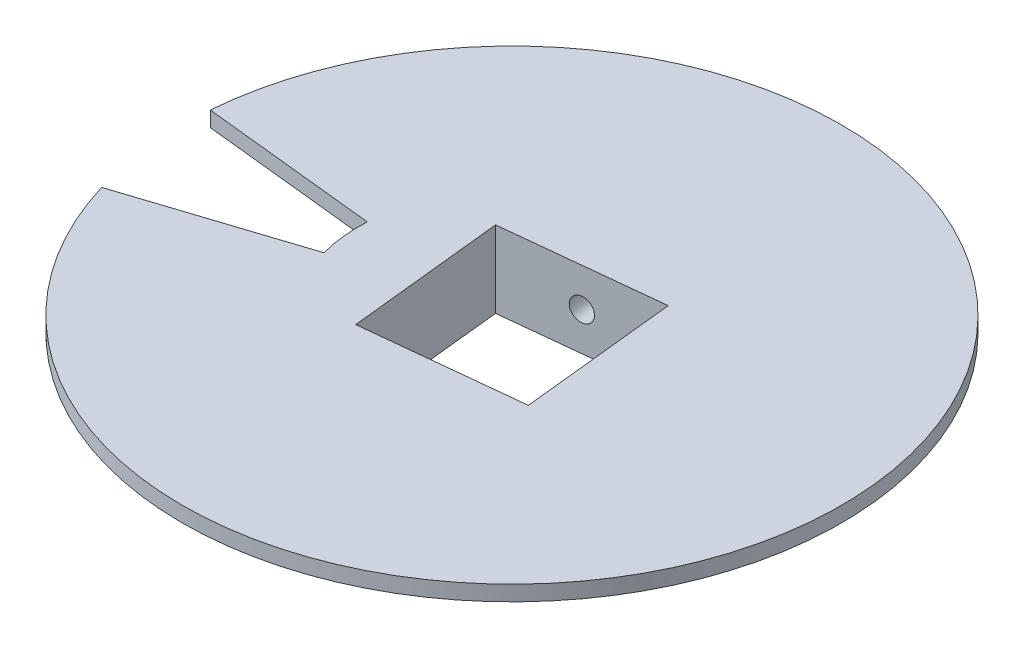
ISO-10303-21;
HEADER;
FILE_DESCRIPTION(('STEP AP214'),'2;1');
FILE_NAME('part.step','',(''),(''),'','','');
FILE_SCHEMA(('AUTOMOTIVE_DESIGN { 1 0 10303 214 1 1 1 1 }'));
ENDSEC;
DATA;
#1=APPLICATION_CONTEXT('core data for automotive mechanical design processes');
#2=APPLICATION_PROTOCOL_DEFINITION('international standard','automotive_design',2000,#1);
#3=PRODUCT_CONTEXT('',#1,'mechanical');
#4=PRODUCT('Part','Part','',(#3));
#5=PRODUCT_RELATED_PRODUCT_CATEGORY('part','',(#4));
#6=PRODUCT_DEFINITION_FORMATION('','',#4);
#7=PRODUCT_DEFINITION_CONTEXT('part definition',#1,'design');
#8=PRODUCT_DEFINITION('design','',#6,#7);
#9=PRODUCT_DEFINITION_SHAPE('','',#8);
#10=(LENGTH_UNIT() NAMED_UNIT(*) SI_UNIT(.MILLI.,.METRE.));
#11=(NAMED_UNIT(*) PLANE_ANGLE_UNIT() SI_UNIT($,.RADIAN.));
#12=(NAMED_UNIT(*) SI_UNIT($,.STERADIAN.) SOLID_ANGLE_UNIT());
#13=UNCERTAINTY_MEASURE_WITH_UNIT(LENGTH_MEASURE(1.E-05),#10,'distance_accuracy_value','');
#14=(GEOMETRIC_REPRESENTATION_CONTEXT(3) GLOBAL_UNCERTAINTY_ASSIGNED_CONTEXT((#13)) GLOBAL_UNIT_ASSIGNED_CONTEXT((#10,
#11,#12)) REPRESENTATION_CONTEXT('',''));
#15=CARTESIAN_POINT('',(0.,0.,0.));
#16=DIRECTION('',(0.,0.,1.));
#17=DIRECTION('',(1.,0.,0.));
#18=AXIS2_PLACEMENT_3D('',#15,#16,#17);
#19=CARTESIAN_POINT('',(0.,-4.,0.));
#20=DIRECTION('',(0.,-1.,0.));
#21=DIRECTION('',(1.,0.,0.));
#22=AXIS2_PLACEMENT_3D('',#19,#20,#21);
#23=PLANE('',#22);
#24=DIRECTION('',(-0.994521895368273,0.,-0.104528463267653));
#25=VECTOR('',#24,1.);
#26=CARTESIAN_POINT('',(-0.209056926535306,-4.00000000000001,1.98904379073655));
#27=LINE('',#26,#25);
#28=CARTESIAN_POINT('',(-39.9401755287793,-4.00000000000001,-2.18686504620218));
#29=VERTEX_POINT('',#28);
#30=CARTESIAN_POINT('',(-85.7148083840375,-4.00000000000001,-6.99797282702119));
#31=VERTEX_POINT('',#30);
#32=EDGE_CURVE('E153',#29,#31,#27,.T.);
#33=ORIENTED_EDGE('',*,*,#32,.T.);
#34=CARTESIAN_POINT('',(0.,-4.,0.));
#35=DIRECTION('',(0.,1.,0.));
#36=DIRECTION('',(-1.,0.,0.));
#37=AXIS2_PLACEMENT_3D('',#34,#35,#36);
#38=CIRCLE('',#37,86.);
#39=CARTESIAN_POINT('',(-82.3867738054415,-4.00000000000001,24.6661610699967));
#40=VERTEX_POINT('',#39);
#41=EDGE_CURVE('E172',#40,#31,#38,.T.);
#42=ORIENTED_EDGE('',*,*,#41,.F.);
#43=DIRECTION('',(-0.951056516295154,0.,0.309016994374948));
#44=VECTOR('',#43,1.);
#45=CARTESIAN_POINT('',(-0.618033988749895,-4.00000000000001,-1.90211303259031));
#46=LINE('',#45,#44);
#47=CARTESIAN_POINT('',(-38.6127120570164,-4.00000000000001,10.4431062238179));
#48=VERTEX_POINT('',#47);
#49=EDGE_CURVE('E156',#48,#40,#46,.T.);
#50=ORIENTED_EDGE('',*,*,#49,.F.);
#51=CARTESIAN_POINT('',(0.,-4.00000000000001,0.));
#52=DIRECTION('',(0.,1.,0.));
#53=DIRECTION('',(0.,0.,1.));
#54=AXIS2_PLACEMENT_3D('',#51,#52,#53);
#55=CIRCLE('',#54,40.);
#56=EDGE_CURVE('E167',#48,#29,#55,.T.);
#57=ORIENTED_EDGE('',*,*,#56,.T.);
#58=EDGE_LOOP('',(#33,#42,#50,#57));
#59=FACE_BOUND('',#58,.T.);
#60=ADVANCED_FACE('F37',(#59),#23,.T.);
#61=CARTESIAN_POINT('',(0.,0.,0.));
#62=DIRECTION('',(0.,1.,0.));
#63=DIRECTION('',(-1.,0.,0.));
#64=AXIS2_PLACEMENT_3D('',#61,#62,#63);
#65=CYLINDRICAL_SURFACE('',#64,86.);
#66=DIRECTION('',(0.,1.,0.));
#67=VECTOR('',#66,1.);
#68=CARTESIAN_POINT('',(-85.7148083840375,0.,-6.99797282702119));
#69=LINE('',#68,#67);
#70=CARTESIAN_POINT('',(-85.7148083840375,0.,-6.99797282702119));
#71=VERTEX_POINT('',#70);
#72=EDGE_CURVE('E165',#71,#31,#69,.F.);
#73=ORIENTED_EDGE('',*,*,#72,.F.);
#74=CARTESIAN_POINT('',(0.,0.,0.));
#75=DIRECTION('',(0.,1.,0.));
#76=DIRECTION('',(-1.,0.,0.));
#77=AXIS2_PLACEMENT_3D('',#74,#75,#76);
#78=CIRCLE('',#77,86.);
#79=CARTESIAN_POINT('',(-82.3867738054415,0.,24.6661610699967));
#80=VERTEX_POINT('',#79);
#81=EDGE_CURVE('E169',#80,#71,#78,.T.);
#82=ORIENTED_EDGE('',*,*,#81,.F.);
#83=DIRECTION('',(0.,1.,0.));
#84=VECTOR('',#83,1.);
#85=CARTESIAN_POINT('',(-82.3867738054415,0.,24.6661610699967));
#86=LINE('',#85,#84);
#87=EDGE_CURVE('E159',#80,#40,#86,.F.);
#88=ORIENTED_EDGE('',*,*,#87,.T.);
#89=ORIENTED_EDGE('',*,*,#41,.T.);
#90=EDGE_LOOP('',(#73,#82,#88,#89));
#91=FACE_BOUND('',#90,.T.);
#92=ADVANCED_FACE('F195',(#91),#65,.T.);
#93=CARTESIAN_POINT('',(0.,0.,0.));
#94=DIRECTION('',(0.,1.,0.));
#95=DIRECTION('',(-1.,0.,0.));
#96=AXIS2_PLACEMENT_3D('',#93,#94,#95);
#97=PLANE('',#96);
#98=DIRECTION('',(0.994521895368273,0.,-0.104528463267654));
#99=VECTOR('',#98,1.);
#100=CARTESIAN_POINT('',(2.14283349698691,0.,20.3876988550496));
#101=LINE('',#100,#99);
#102=CARTESIAN_POINT('',(-18.2448653580628,0.,22.5305323520365));
#103=VERTEX_POINT('',#102);
#104=CARTESIAN_POINT('',(22.5305323520365,0.,18.2448653580627));
#105=VERTEX_POINT('',#104);
#106=EDGE_CURVE('E52',#103,#105,#101,.T.);
#107=ORIENTED_EDGE('',*,*,#106,.F.);
#108=DIRECTION('',(0.104528463267654,0.,0.994521895368273));
#109=VECTOR('',#108,1.);
#110=CARTESIAN_POINT('',(-20.3876988550497,0.,2.14283349698692));
#111=LINE('',#110,#109);
#112=CARTESIAN_POINT('',(-22.5305323520367,0.,-18.2448653580628));
#113=VERTEX_POINT('',#112);
#114=EDGE_CURVE('E120',#113,#103,#111,.T.);
#115=ORIENTED_EDGE('',*,*,#114,.F.);
#116=DIRECTION('',(-0.994521895368273,0.,0.104528463267654));
#117=VECTOR('',#116,1.);
#118=CARTESIAN_POINT('',(-2.14283349698692,0.,-20.3876988550497));
#119=LINE('',#118,#117);
#120=CARTESIAN_POINT('',(18.2448653580627,0.,-22.5305323520367));
#121=VERTEX_POINT('',#120);
#122=EDGE_CURVE('E123',#121,#113,#119,.T.);
#123=ORIENTED_EDGE('',*,*,#122,.F.);
#124=DIRECTION('',(-0.104528463267654,0.,-0.994521895368273));
#125=VECTOR('',#124,1.);
#126=CARTESIAN_POINT('',(20.3876988550496,0.,-2.14283349698691));
#127=LINE('',#126,#125);
#128=EDGE_CURVE('E137',#105,#121,#127,.T.);
#129=ORIENTED_EDGE('',*,*,#128,.F.);
#130=EDGE_LOOP('',(#107,#115,#123,#129));
#131=FACE_BOUND('',#130,.T.);
#132=DIRECTION('',(-0.994521895368273,0.,-0.104528463267653));
#133=VECTOR('',#132,1.);
#134=CARTESIAN_POINT('',(-0.209056926535306,0.,1.98904379073655));
#135=LINE('',#134,#133);
#136=CARTESIAN_POINT('',(-39.9401755287793,0.,-2.18686504620218));
#137=VERTEX_POINT('',#136);
#138=EDGE_CURVE('E150',#137,#71,#135,.T.);
#139=ORIENTED_EDGE('',*,*,#138,.F.);
#140=CARTESIAN_POINT('',(0.,0.,0.));
#141=DIRECTION('',(0.,-1.,0.));
#142=DIRECTION('',(1.,0.,0.));
#143=AXIS2_PLACEMENT_3D('',#140,#141,#142);
#144=CIRCLE('',#143,40.);
#145=CARTESIAN_POINT('',(-38.6127120570164,0.,10.4431062238179));
#146=VERTEX_POINT('',#145);
#147=EDGE_CURVE('E143',#146,#137,#144,.T.);
#148=ORIENTED_EDGE('',*,*,#147,.F.);
#149=DIRECTION('',(-0.951056516295154,0.,0.309016994374948));
#150=VECTOR('',#149,1.);
#151=CARTESIAN_POINT('',(-0.618033988749895,0.,-1.90211303259031));
#152=LINE('',#151,#150);
#153=EDGE_CURVE('E157',#146,#80,#152,.T.);
#154=ORIENTED_EDGE('',*,*,#153,.T.);
#155=ORIENTED_EDGE('',*,*,#81,.T.);
#156=EDGE_LOOP('',(#139,#148,#154,#155));
#157=FACE_BOUND('',#156,.T.);
#158=ADVANCED_FACE('F192',(#131,#157),#97,.T.);
#159=CARTESIAN_POINT('',(-0.618033988749895,-4.00000000000001,-1.90211303259031));
#160=DIRECTION('',(-0.309016994374948,0.,-0.951056516295154));
#161=DIRECTION('',(-0.951056516295154,0.,0.309016994374948));
#162=AXIS2_PLACEMENT_3D('',#159,#160,#161);
#163=PLANE('',#162);
#164=ORIENTED_EDGE('',*,*,#153,.F.);
#165=DIRECTION('',(0.,1.,0.));
#166=VECTOR('',#165,1.);
#167=CARTESIAN_POINT('',(-38.6127120570164,-4.00000000000001,10.4431062238179));
#168=LINE('',#167,#166);
#169=EDGE_CURVE('E45',#146,#48,#168,.F.);
#170=ORIENTED_EDGE('',*,*,#169,.T.);
#171=ORIENTED_EDGE('',*,*,#49,.T.);
#172=ORIENTED_EDGE('',*,*,#87,.F.);
#173=EDGE_LOOP('',(#164,#170,#171,#172));
#174=FACE_BOUND('',#173,.T.);
#175=ADVANCED_FACE('F178',(#174),#163,.T.);
#176=CARTESIAN_POINT('',(-0.209056926535306,-4.00000000000001,1.98904379073655));
#177=DIRECTION('',(0.104528463267653,0.,-0.994521895368273));
#178=DIRECTION('',(-0.994521895368273,0.,-0.104528463267653));
#179=AXIS2_PLACEMENT_3D('',#176,#177,#178);
#180=PLANE('',#179);
#181=ORIENTED_EDGE('',*,*,#72,.T.);
#182=ORIENTED_EDGE('',*,*,#32,.F.);
#183=DIRECTION('',(0.,1.,0.));
#184=VECTOR('',#183,1.);
#185=CARTESIAN_POINT('',(-39.9401755287793,-4.00000000000001,-2.18686504620218));
#186=LINE('',#185,#184);
#187=EDGE_CURVE('E11',#137,#29,#186,.F.);
#188=ORIENTED_EDGE('',*,*,#187,.F.);
#189=ORIENTED_EDGE('',*,*,#138,.T.);
#190=EDGE_LOOP('',(#181,#182,#188,#189));
#191=FACE_BOUND('',#190,.T.);
#192=ADVANCED_FACE('F189',(#191),#180,.F.);
#193=CARTESIAN_POINT('',(0.,-20.,0.));
#194=DIRECTION('',(0.,1.,0.));
#195=DIRECTION('',(-1.,0.,0.));
#196=AXIS2_PLACEMENT_3D('',#193,#194,#195);
#197=CYLINDRICAL_SURFACE('',#196,40.);
#198=CARTESIAN_POINT('',(-1.18579680908048,-10.,-39.9824197107626));
#199=CARTESIAN_POINT('',(-1.18580429969003,-9.8317431314442,-39.9824204307887));
#200=CARTESIAN_POINT('',(-1.20003427236242,-9.6633702964108,-39.9820053141335));
#201=CARTESIAN_POINT('',(-1.25658390792008,-9.33127916870422,-39.980267210594));
#202=CARTESIAN_POINT('',(-1.29893577541237,-9.16756643710408,-39.9789431827847));
#203=CARTESIAN_POINT('',(-1.41047349603417,-8.84965363313913,-39.9751630370906));
#204=CARTESIAN_POINT('',(-1.47964459167795,-8.69544838320168,-39.9727075416647));
#205=CARTESIAN_POINT('',(-1.64278985708904,-8.40085498908478,-39.966334253512));
#206=CARTESIAN_POINT('',(-1.73675856089689,-8.2604638093195,-39.9624167829592));
#207=CARTESIAN_POINT('',(-1.94699418178614,-7.99714995243253,-39.95272549713));
#208=CARTESIAN_POINT('',(-2.06330232138514,-7.8742603122085,-39.9469482364849));
#209=CARTESIAN_POINT('',(-2.31477157254382,-7.64972135070457,-39.9331648643504));
#210=CARTESIAN_POINT('',(-2.4499334909992,-7.54807293896273,-39.9251586574528));
#211=CARTESIAN_POINT('',(-2.73541234024617,-7.36879489583059,-39.9066156468007));
#212=CARTESIAN_POINT('',(-2.8857467563554,-7.29119340581087,-39.8960759035371));
#213=CARTESIAN_POINT('',(-3.19713303622388,-7.1623920757591,-39.8723299563986));
#214=CARTESIAN_POINT('',(-3.35818474404619,-7.11119185168257,-39.8591237913145));
#215=CARTESIAN_POINT('',(-3.68607728581946,-7.03674032139104,-39.8301375467512));
#216=CARTESIAN_POINT('',(-3.85290655217476,-7.01343615404408,-39.8143623999964));
#217=CARTESIAN_POINT('',(-4.18787477133608,-6.99527491555166,-39.7805233383962));
#218=CARTESIAN_POINT('',(-4.35601370390763,-7.00041740576974,-39.7624594588464));
#219=CARTESIAN_POINT('',(-4.68847586567301,-7.03896012170817,-39.7246288542982));
#220=CARTESIAN_POINT('',(-4.85280608856538,-7.07230349768423,-39.7048656269405));
#221=CARTESIAN_POINT('',(-5.17336864882447,-7.16621316779689,-39.6643716135608));
#222=CARTESIAN_POINT('',(-5.32960092165512,-7.22677967884922,-39.6436408198304));
#223=CARTESIAN_POINT('',(-5.62975028238228,-7.37348016036666,-39.6021327031986));
#224=CARTESIAN_POINT('',(-5.77365485665011,-7.45963972278195,-39.5813553544822));
#225=CARTESIAN_POINT('',(-6.04497820835389,-7.65506196118452,-39.5408280866301));
#226=CARTESIAN_POINT('',(-6.17239671592198,-7.76432501528615,-39.5210781843163));
#227=CARTESIAN_POINT('',(-6.40751495172782,-8.00317335931485,-39.4836420714088));
#228=CARTESIAN_POINT('',(-6.5151653563531,-8.13280802383177,-39.4659610617234));
#229=CARTESIAN_POINT('',(-6.7073682982983,-8.40854727465756,-39.4337512557431));
#230=CARTESIAN_POINT('',(-6.7919208214047,-8.55465187110129,-39.4192224613879));
#231=CARTESIAN_POINT('',(-6.93557490212524,-8.85921700874966,-39.3942019101334));
#232=CARTESIAN_POINT('',(-6.9946741225029,-9.01767868305944,-39.3837105239765));
#233=CARTESIAN_POINT('',(-7.08574651351229,-9.34244416121864,-39.3674275932348));
#234=CARTESIAN_POINT('',(-7.11772014491847,-9.5087478318077,-39.3616359688168));
#235=CARTESIAN_POINT('',(-7.15359367659644,-9.84404315381494,-39.3551322688095));
#236=CARTESIAN_POINT('',(-7.15756172898413,-10.0130272761831,-39.3544078620867));
#237=CARTESIAN_POINT('',(-7.1374924861896,-10.349267519701,-39.3580525557769));
#238=CARTESIAN_POINT('',(-7.11345540193857,-10.5165236538561,-39.3624216178265));
#239=CARTESIAN_POINT('',(-7.03809874791777,-10.8443631467125,-39.3759649238287));
#240=CARTESIAN_POINT('',(-6.98681081753996,-11.0049540114315,-39.3851335950488));
#241=CARTESIAN_POINT('',(-6.85840739298776,-11.3151365347476,-39.4076956011325));
#242=CARTESIAN_POINT('',(-6.78129156215627,-11.4647280499413,-39.4210889910637));
#243=CARTESIAN_POINT('',(-6.60320177495021,-11.7489821051146,-39.4513100977189));
#244=CARTESIAN_POINT('',(-6.50218211927371,-11.883615314204,-39.4681443842433));
#245=CARTESIAN_POINT('',(-6.27916364078341,-12.1338349964868,-39.5042381338401));
#246=CARTESIAN_POINT('',(-6.15716452478055,-12.2494212034533,-39.523497630804));
#247=CARTESIAN_POINT('',(-5.89529910367278,-12.4585005042157,-39.5634047008749));
#248=CARTESIAN_POINT('',(-5.75539743811936,-12.5519488013881,-39.5840549817007));
#249=CARTESIAN_POINT('',(-5.4618209595312,-12.7137926301878,-39.6256288418666));
#250=CARTESIAN_POINT('',(-5.30814626149196,-12.7821883709628,-39.6465524189236));
#251=CARTESIAN_POINT('',(-4.99150511403241,-12.89190821671,-39.6876595051506));
#252=CARTESIAN_POINT('',(-4.82854845934879,-12.9332603044185,-39.7078437588306));
#253=CARTESIAN_POINT('',(-4.49781051822772,-12.9878105194003,-39.7466654160615));
#254=CARTESIAN_POINT('',(-4.33002930408568,-13.0010090683283,-39.7653028427753));
#255=CARTESIAN_POINT('',(-3.99483605055098,-12.9988730255785,-39.8003720238971));
#256=CARTESIAN_POINT('',(-3.82742411553962,-12.9836083708725,-39.8168090785007));
#257=CARTESIAN_POINT('',(-3.49732177617217,-12.925124712337,-39.8471608051493));
#258=CARTESIAN_POINT('',(-3.33463137914973,-12.8819056650902,-39.8610754732767));
#259=CARTESIAN_POINT('',(-3.01861115686088,-12.7687570389133,-39.886252439809));
#260=CARTESIAN_POINT('',(-2.86528102613292,-12.6988283321634,-39.8975148248024));
#261=CARTESIAN_POINT('',(-2.57233838393239,-12.5342539344931,-39.9174730857667));
#262=CARTESIAN_POINT('',(-2.43272559565276,-12.4396087424764,-39.9261690135341));
#263=CARTESIAN_POINT('',(-2.17087597977937,-12.2280263784834,-39.9412639787596));
#264=CARTESIAN_POINT('',(-2.04868038476335,-12.1110377937764,-39.9476576187264));
#265=CARTESIAN_POINT('',(-1.82552545276615,-11.858175270943,-39.9584781228353));
#266=CARTESIAN_POINT('',(-1.72457128867604,-11.7222967459289,-39.9629045081865));
#267=CARTESIAN_POINT('',(-1.54670970260564,-11.435295383436,-39.9701845149496));
#268=CARTESIAN_POINT('',(-1.46984089096274,-11.2841485775931,-39.9730356166103));
#269=CARTESIAN_POINT('',(-1.34268429679903,-10.9711815421287,-39.9775097362102));
#270=CARTESIAN_POINT('',(-1.29236570532633,-10.8093739297954,-39.9791341785169));
#271=CARTESIAN_POINT('',(-1.23270114281652,-10.5388300296903,-39.9810074404126));
#272=CARTESIAN_POINT('',(-1.21513556340589,-10.4318377399973,-39.9815405569221));
#273=CARTESIAN_POINT('',(-1.19168099779456,-10.2165796506869,-39.9822464599635));
#274=CARTESIAN_POINT('',(-1.1857919870676,-10.1083138537451,-39.9824192472522));
#275=CARTESIAN_POINT('',(-1.18579680908048,-10.,-39.9824197107626));
#276=B_SPLINE_CURVE_WITH_KNOTS('',3,(#198,#199,#200,#201,#202,#203,#204,#205,#206,#207,#208,
#209,#210,#211,#212,#213,#214,#215,#216,#217,#218,#219,#220,#221,#222,#223,#224,#225,#226,#227,
#228,#229,#230,#231,#232,#233,#234,#235,#236,#237,#238,#239,#240,#241,#242,#243,#244,#245,#246,
#247,#248,#249,#250,#251,#252,#253,#254,#255,#256,#257,#258,#259,#260,#261,#262,#263,#264,#265,
#266,#267,#268,#269,#270,#271,#272,#273,#274,#275),.UNSPECIFIED.,.T.,.F.,(4,2,2,2,2,2,2,2,2,2,2,
2,2,2,2,2,2,2,2,2,2,2,2,2,2,2,2,2,2,2,2,2,2,2,2,2,2,2,4),(0.,0.504375158678085,1.00932891572159,
1.51400521152438,2.01857035792286,2.52407567218004,3.0296026274716,3.53571897042051,
4.04182795096937,4.54697636348321,5.05211698682554,5.55624172519159,6.06037048052796,
6.5650050497415,7.06964787850087,7.57553322812759,8.08141888905544,8.58735099277641,
9.09327450220475,9.59796641118963,10.1026545189226,10.6067579386191,11.110867929372,
11.6159495765132,12.1210382827706,12.6271404816974,13.1332384554068,13.638811924989,
14.1443778225593,14.6487031301784,15.1530292210894,15.6573388450885,16.1616382903561,
16.6671124356828,17.1727095361933,17.6791130423731,18.1849276168994,18.5096152946703,
18.8343022904443),.UNSPECIFIED.);
#277=CARTESIAN_POINT('',(-1.18579680908048,-10.,-39.9824197107626));
#278=VERTEX_POINT('',#277);
#279=EDGE_CURVE('E126',#278,#278,#276,.T.);
#280=ORIENTED_EDGE('',*,*,#279,.T.);
#281=EDGE_LOOP('',(#280));
#282=FACE_BOUND('',#281,.T.);
#283=CARTESIAN_POINT('',(7.15292818129011,-10.,39.3552489311566));
#284=CARTESIAN_POINT('',(7.1529210040702,-10.1682568685558,39.3552511928337));
#285=CARTESIAN_POINT('',(7.13891568283652,-10.3366297035892,39.357803725152));
#286=CARTESIAN_POINT('',(7.08324042044772,-10.6687208312958,39.367860933689));
#287=CARTESIAN_POINT('',(7.04153876201303,-10.8324335628959,39.3753712874437));
#288=CARTESIAN_POINT('',(6.93165247171269,-11.1503463668609,39.394863743087));
#289=CARTESIAN_POINT('',(6.8634824042628,-11.3045516167983,39.4068433855785));
#290=CARTESIAN_POINT('',(6.70257717321396,-11.5991450109152,39.4345291770437));
#291=CARTESIAN_POINT('',(6.6098474231139,-11.7395361906805,39.4502345047142));
#292=CARTESIAN_POINT('',(6.40219102332934,-12.0028500475675,39.4844654401415));
#293=CARTESIAN_POINT('',(6.28722333560576,-12.1257396877915,39.5029962484627));
#294=CARTESIAN_POINT('',(6.0383835667209,-12.3502786492954,39.5417974732763));
#295=CARTESIAN_POINT('',(5.90451067646009,-12.4519270610373,39.5620679642087));
#296=CARTESIAN_POINT('',(5.62141491631137,-12.6312051041694,39.6032845530686));
#297=CARTESIAN_POINT('',(5.4721743320437,-12.7088065941891,39.6242314111243));
#298=CARTESIAN_POINT('',(5.16265552946929,-12.8376079242409,39.6657452178486));
#299=CARTESIAN_POINT('',(5.00237747175696,-12.8888081483174,39.6863121720391));
#300=CARTESIAN_POINT('',(4.67562358960531,-12.963259678609,39.7261320392318));
#301=CARTESIAN_POINT('',(4.509160105553,-12.9865638459559,39.7453873721282));
#302=CARTESIAN_POINT('',(4.1744762091453,-13.0047250844483,39.7819315840289));
#303=CARTESIAN_POINT('',(4.00625582392056,-12.9995825942303,39.7992204933505));
#304=CARTESIAN_POINT('',(3.67319333309872,-12.9610398782918,39.8313393484631));
#305=CARTESIAN_POINT('',(3.50834511383254,-12.9276965023158,39.8461741695344));
#306=CARTESIAN_POINT('',(3.18636843584026,-12.8337868322031,39.8732137514193));
#307=CARTESIAN_POINT('',(3.02924003863728,-12.7732203211508,39.8854184912751));
#308=CARTESIAN_POINT('',(2.72701963886865,-12.6265198396333,39.9072219876674));
#309=CARTESIAN_POINT('',(2.58193987111161,-12.540360277218,39.9168181172232));
#310=CARTESIAN_POINT('',(2.30811949283614,-12.3449380388155,39.9335877642204));
#311=CARTESIAN_POINT('',(2.17937914978578,-12.2356749847138,39.9407612420074));
#312=CARTESIAN_POINT('',(1.94161540601129,-11.9968266406851,39.9530270279346));
#313=CARTESIAN_POINT('',(1.83264133238999,-11.8671919761682,39.9581141683752));
#314=CARTESIAN_POINT('',(1.63794169065004,-11.5914527253424,39.9665694625754));
#315=CARTESIAN_POINT('',(1.55221613683761,-11.4453481288987,39.9699376152773));
#316=CARTESIAN_POINT('',(1.40649917732867,-11.1407829912503,39.9753311859142));
#317=CARTESIAN_POINT('',(1.34651013487612,-10.9823213169406,39.9773564805511));
#318=CARTESIAN_POINT('',(1.25404248245523,-10.6575558387814,39.9803643857149));
#319=CARTESIAN_POINT('',(1.22156340518318,-10.4912521681923,39.9813470139532));
#320=CARTESIAN_POINT('',(1.18512160097745,-10.1559568461851,39.982443962022));
#321=CARTESIAN_POINT('',(1.18108964742827,-9.98697272381689,39.9825603898053));
#322=CARTESIAN_POINT('',(1.20147810354393,-9.650732480299,39.9819528079909));
#323=CARTESIAN_POINT('',(1.22589829891072,-9.48347634614387,39.9812288047232));
#324=CARTESIAN_POINT('',(1.30242404089067,-9.15563685328747,39.9788086276435));
#325=CARTESIAN_POINT('',(1.35449748087225,-8.99504598856854,39.9771135810759));
#326=CARTESIAN_POINT('',(1.4847858873571,-8.68486346525242,39.972485980089));
#327=CARTESIAN_POINT('',(1.56300119460988,-8.53527195005865,39.9695534095389));
#328=CARTESIAN_POINT('',(1.74348261406376,-8.2510178948854,39.9620871637299));
#329=CARTESIAN_POINT('',(1.84579479286567,-8.11638468579604,39.9575504132862));
#330=CARTESIAN_POINT('',(2.07144409502689,-7.86616500351318,39.9464872789092));
#331=CARTESIAN_POINT('',(2.19478151221479,-7.75057879654675,39.9399608671694));
#332=CARTESIAN_POINT('',(2.45922169200054,-7.54149949578429,39.9245509895424));
#333=CARTESIAN_POINT('',(2.60035960530264,-7.44805119861195,39.9156628203532));
#334=CARTESIAN_POINT('',(2.89616442502644,-7.28620736981222,39.8952902098801));
#335=CARTESIAN_POINT('',(3.05083121849089,-7.21781162903718,39.8838057902719));
#336=CARTESIAN_POINT('',(3.36909964097408,-7.10809178329002,39.8581811916872));
#337=CARTESIAN_POINT('',(3.53269184408697,-7.06673969558153,39.8440437773916));
#338=CARTESIAN_POINT('',(3.86427384406143,-7.01218948059973,39.8132528037126));
#339=CARTESIAN_POINT('',(4.03226357502321,-6.9989909316717,39.7965992820167));
#340=CARTESIAN_POINT('',(4.36742334449297,-7.00112697442154,39.7612115212976));
#341=CARTESIAN_POINT('',(4.53459438287324,-7.01639162912749,39.74248248835));
#342=CARTESIAN_POINT('',(4.86379367292888,-7.074875287663,39.7035388214287));
#343=CARTESIAN_POINT('',(5.02582191661634,-7.11809433490976,39.6833241851477));
#344=CARTESIAN_POINT('',(5.34017092451292,-7.23124296108666,39.6422466758063));
#345=CARTESIAN_POINT('',(5.49249200551131,-7.30117166783664,39.6213838239333));
#346=CARTESIAN_POINT('',(5.78318270391525,-7.46574606550691,39.5799997489578));
#347=CARTESIAN_POINT('',(5.92155260284807,-7.56039125752355,39.5594785189686));
#348=CARTESIAN_POINT('',(6.18081859611057,-7.77197362151663,39.5198020266109));
#349=CARTESIAN_POINT('',(6.30167323669169,-7.88896220622358,39.500650057434));
#350=CARTESIAN_POINT('',(6.52220140732147,-8.14182472905697,39.4648375883411));
#351=CARTESIAN_POINT('',(6.62186977797286,-8.27770325407114,39.4481776956012));
#352=CARTESIAN_POINT('',(6.79735826016561,-8.56470461656404,39.4183191136584));
#353=CARTESIAN_POINT('',(6.87314008121234,-8.71585142240695,39.4051259873074));
#354=CARTESIAN_POINT('',(6.99844822048201,-9.02881845787132,39.3830649941684));
#355=CARTESIAN_POINT('',(7.04800497054996,-9.19062607020459,39.3741921150805));
#356=CARTESIAN_POINT('',(7.10675519226583,-9.4611699703097,39.363619481636));
#357=CARTESIAN_POINT('',(7.12404776277673,-9.56816226000275,39.3604888589552));
#358=CARTESIAN_POINT('',(7.14713655535059,-9.78342034931307,39.3563028579278));
#359=CARTESIAN_POINT('',(7.15293280156122,-9.8916861462549,39.3552474752222));
#360=CARTESIAN_POINT('',(7.15292818129011,-10.,39.3552489311566));
#361=B_SPLINE_CURVE_WITH_KNOTS('',3,(#283,#284,#285,#286,#287,#288,#289,#290,#291,#292,#293,
#294,#295,#296,#297,#298,#299,#300,#301,#302,#303,#304,#305,#306,#307,#308,#309,#310,#311,#312,
#313,#314,#315,#316,#317,#318,#319,#320,#321,#322,#323,#324,#325,#326,#327,#328,#329,#330,#331,
#332,#333,#334,#335,#336,#337,#338,#339,#340,#341,#342,#343,#344,#345,#346,#347,#348,#349,#350,
#351,#352,#353,#354,#355,#356,#357,#358,#359,#360),.UNSPECIFIED.,.T.,.F.,(4,2,2,2,2,2,2,2,2,2,2,
2,2,2,2,2,2,2,2,2,2,2,2,2,2,2,2,2,2,2,2,2,2,2,2,2,2,2,4),(0.,0.504375158678085,1.00932891572159,
1.51400521152438,2.01857035792286,2.52407567218004,3.0296026274716,3.53571897042051,
4.04182795096937,4.54697636348321,5.05211698682554,5.55624172519159,6.06037048052796,
6.56500504974149,7.06964787850087,7.57553322812759,8.08141888905544,8.58735099277641,
9.09327450220475,9.59796641118963,10.1026545189226,10.6067579386191,11.110867929372,
11.6159495765132,12.1210382827706,12.6271404816974,13.1332384554068,13.638811924989,
14.1443778225593,14.6487031301784,15.1530292210894,15.6573388450885,16.1616382903561,
16.6671124356828,17.1727095361933,17.6791130423731,18.1849276168995,18.5096152946703,
18.8343022904443),.UNSPECIFIED.);
#362=CARTESIAN_POINT('',(7.15292818129011,-10.,39.3552489311566));
#363=VERTEX_POINT('',#362);
#364=EDGE_CURVE('E213',#363,#363,#361,.T.);
#365=ORIENTED_EDGE('',*,*,#364,.T.);
#366=EDGE_LOOP('',(#365));
#367=FACE_BOUND('',#366,.T.);
#368=ORIENTED_EDGE('',*,*,#169,.F.);
#369=ORIENTED_EDGE('',*,*,#147,.T.);
#370=ORIENTED_EDGE('',*,*,#187,.T.);
#371=ORIENTED_EDGE('',*,*,#56,.F.);
#372=EDGE_LOOP('',(#368,#369,#370,#371));
#373=FACE_BOUND('',#372,.T.);
#374=CARTESIAN_POINT('',(0.,-20.,0.));
#375=DIRECTION('',(0.,-1.,0.));
#376=DIRECTION('',(1.,0.,0.));
#377=AXIS2_PLACEMENT_3D('',#374,#375,#376);
#378=CIRCLE('',#377,40.);
#379=CARTESIAN_POINT('',(40.,-20.,0.));
#380=VERTEX_POINT('',#379);
#381=EDGE_CURVE('E147',#380,#380,#378,.T.);
#382=ORIENTED_EDGE('',*,*,#381,.F.);
#383=EDGE_LOOP('',(#382));
#384=FACE_BOUND('',#383,.T.);
#385=ADVANCED_FACE('F185',(#282,#367,#373,#384),#197,.T.);
#386=CARTESIAN_POINT('',(0.,-20.,0.));
#387=DIRECTION('',(0.,-1.,0.));
#388=DIRECTION('',(1.,0.,0.));
#389=AXIS2_PLACEMENT_3D('',#386,#387,#388);
#390=PLANE('',#389);
#391=DIRECTION('',(0.994521895368273,0.,-0.104528463267654));
#392=VECTOR('',#391,1.);
#393=CARTESIAN_POINT('',(2.14283349698691,-20.,20.3876988550496));
#394=LINE('',#393,#392);
#395=CARTESIAN_POINT('',(-18.2448653580628,-20.,22.5305323520365));
#396=VERTEX_POINT('',#395);
#397=CARTESIAN_POINT('',(22.5305323520365,-20.,18.2448653580627));
#398=VERTEX_POINT('',#397);
#399=EDGE_CURVE('E104',#396,#398,#394,.T.);
#400=ORIENTED_EDGE('',*,*,#399,.T.);
#401=DIRECTION('',(-0.104528463267654,0.,-0.994521895368273));
#402=VECTOR('',#401,1.);
#403=CARTESIAN_POINT('',(20.3876988550496,-20.,-2.14283349698691));
#404=LINE('',#403,#402);
#405=CARTESIAN_POINT('',(18.2448653580627,-20.,-22.5305323520367));
#406=VERTEX_POINT('',#405);
#407=EDGE_CURVE('E113',#398,#406,#404,.T.);
#408=ORIENTED_EDGE('',*,*,#407,.T.);
#409=DIRECTION('',(-0.994521895368273,0.,0.104528463267654));
#410=VECTOR('',#409,1.);
#411=CARTESIAN_POINT('',(-2.14283349698692,-20.,-20.3876988550497));
#412=LINE('',#411,#410);
#413=CARTESIAN_POINT('',(-22.5305323520367,-20.,-18.2448653580628));
#414=VERTEX_POINT('',#413);
#415=EDGE_CURVE('E60',#406,#414,#412,.T.);
#416=ORIENTED_EDGE('',*,*,#415,.T.);
#417=DIRECTION('',(0.104528463267654,0.,0.994521895368273));
#418=VECTOR('',#417,1.);
#419=CARTESIAN_POINT('',(-20.3876988550497,-20.,2.14283349698692));
#420=LINE('',#419,#418);
#421=EDGE_CURVE('E110',#414,#396,#420,.T.);
#422=ORIENTED_EDGE('',*,*,#421,.T.);
#423=EDGE_LOOP('',(#400,#408,#416,#422));
#424=FACE_BOUND('',#423,.T.);
#425=ORIENTED_EDGE('',*,*,#381,.T.);
#426=EDGE_LOOP('',(#425));
#427=FACE_BOUND('',#426,.T.);
#428=ADVANCED_FACE('F117',(#424,#427),#390,.T.);
#429=CARTESIAN_POINT('',(2.14283349698691,-20.,20.3876988550496));
#430=DIRECTION('',(0.104528463267654,0.,0.994521895368273));
#431=DIRECTION('',(0.994521895368273,0.,-0.104528463267654));
#432=AXIS2_PLACEMENT_3D('',#429,#430,#431);
#433=PLANE('',#432);
#434=CARTESIAN_POINT('',(2.1428334969869,-10.,20.3876988550496));
#435=DIRECTION('',(0.104528463267654,0.,0.994521895368273));
#436=DIRECTION('',(0.994521895368273,0.,-0.104528463267654));
#437=AXIS2_PLACEMENT_3D('',#434,#435,#436);
#438=CIRCLE('',#437,3.);
#439=CARTESIAN_POINT('',(5.12639918309172,-10.,20.0741134652466));
#440=VERTEX_POINT('',#439);
#441=EDGE_CURVE('E219',#440,#440,#438,.T.);
#442=ORIENTED_EDGE('',*,*,#441,.T.);
#443=EDGE_LOOP('',(#442));
#444=FACE_BOUND('',#443,.T.);
#445=ORIENTED_EDGE('',*,*,#106,.T.);
#446=DIRECTION('',(0.,1.,0.));
#447=VECTOR('',#446,1.);
#448=CARTESIAN_POINT('',(22.5305323520365,-20.,18.2448653580627));
#449=LINE('',#448,#447);
#450=EDGE_CURVE('E100',#398,#105,#449,.T.);
#451=ORIENTED_EDGE('',*,*,#450,.F.);
#452=ORIENTED_EDGE('',*,*,#399,.F.);
#453=DIRECTION('',(0.,1.,0.));
#454=VECTOR('',#453,1.);
#455=CARTESIAN_POINT('',(-18.2448653580628,-20.,22.5305323520365));
#456=LINE('',#455,#454);
#457=EDGE_CURVE('E141',#396,#103,#456,.T.);
#458=ORIENTED_EDGE('',*,*,#457,.T.);
#459=EDGE_LOOP('',(#445,#451,#452,#458));
#460=FACE_BOUND('',#459,.T.);
#461=ADVANCED_FACE('F102',(#444,#460),#433,.F.);
#462=CARTESIAN_POINT('',(-20.3876988550497,-20.,2.14283349698692));
#463=DIRECTION('',(-0.994521895368273,0.,0.104528463267654));
#464=DIRECTION('',(0.104528463267654,0.,0.994521895368273));
#465=AXIS2_PLACEMENT_3D('',#462,#463,#464);
#466=PLANE('',#465);
#467=ORIENTED_EDGE('',*,*,#114,.T.);
#468=ORIENTED_EDGE('',*,*,#457,.F.);
#469=ORIENTED_EDGE('',*,*,#421,.F.);
#470=DIRECTION('',(0.,1.,0.));
#471=VECTOR('',#470,1.);
#472=CARTESIAN_POINT('',(-22.5305323520367,-20.,-18.2448653580628));
#473=LINE('',#472,#471);
#474=EDGE_CURVE('E144',#414,#113,#473,.T.);
#475=ORIENTED_EDGE('',*,*,#474,.T.);
#476=EDGE_LOOP('',(#467,#468,#469,#475));
#477=FACE_BOUND('',#476,.T.);
#478=ADVANCED_FACE('F226',(#477),#466,.F.);
#479=CARTESIAN_POINT('',(-2.14283349698692,-20.,-20.3876988550497));
#480=DIRECTION('',(-0.104528463267654,0.,-0.994521895368273));
#481=DIRECTION('',(-0.994521895368273,0.,0.104528463267654));
#482=AXIS2_PLACEMENT_3D('',#479,#480,#481);
#483=PLANE('',#482);
#484=CARTESIAN_POINT('',(-2.14283349698692,-10.,-20.3876988550497));
#485=DIRECTION('',(-0.104528463267654,0.,-0.994521895368273));
#486=DIRECTION('',(-0.994521895368273,0.,0.104528463267654));
#487=AXIS2_PLACEMENT_3D('',#484,#485,#486);
#488=CIRCLE('',#487,3.);
#489=CARTESIAN_POINT('',(-5.12639918309174,-10.,-20.0741134652468));
#490=VERTEX_POINT('',#489);
#491=EDGE_CURVE('E40',#490,#490,#488,.T.);
#492=ORIENTED_EDGE('',*,*,#491,.T.);
#493=EDGE_LOOP('',(#492));
#494=FACE_BOUND('',#493,.T.);
#495=ORIENTED_EDGE('',*,*,#122,.T.);
#496=ORIENTED_EDGE('',*,*,#474,.F.);
#497=ORIENTED_EDGE('',*,*,#415,.F.);
#498=DIRECTION('',(0.,1.,0.));
#499=VECTOR('',#498,1.);
#500=CARTESIAN_POINT('',(18.2448653580627,-20.,-22.5305323520367));
#501=LINE('',#500,#499);
#502=EDGE_CURVE('E109',#406,#121,#501,.T.);
#503=ORIENTED_EDGE('',*,*,#502,.T.);
#504=EDGE_LOOP('',(#495,#496,#497,#503));
#505=FACE_BOUND('',#504,.T.);
#506=ADVANCED_FACE('F230',(#494,#505),#483,.F.);
#507=CARTESIAN_POINT('',(20.3876988550496,-20.,-2.14283349698691));
#508=DIRECTION('',(0.994521895368273,0.,-0.104528463267654));
#509=DIRECTION('',(-0.104528463267654,0.,-0.994521895368273));
#510=AXIS2_PLACEMENT_3D('',#507,#508,#509);
#511=PLANE('',#510);
#512=ORIENTED_EDGE('',*,*,#128,.T.);
#513=ORIENTED_EDGE('',*,*,#502,.F.);
#514=ORIENTED_EDGE('',*,*,#407,.F.);
#515=ORIENTED_EDGE('',*,*,#450,.T.);
#516=EDGE_LOOP('',(#512,#513,#514,#515));
#517=FACE_BOUND('',#516,.T.);
#518=ADVANCED_FACE('F114',(#517),#511,.F.);
#519=CARTESIAN_POINT('',(-9.87673981308036,-10.,-93.9709022011764));
#520=DIRECTION('',(0.104528463267654,0.,0.994521895368273));
#521=DIRECTION('',(0.994521895368273,0.,-0.104528463267654));
#522=AXIS2_PLACEMENT_3D('',#519,#520,#521);
#523=CYLINDRICAL_SURFACE('',#522,3.);
#524=ORIENTED_EDGE('',*,*,#491,.F.);
#525=EDGE_LOOP('',(#524));
#526=FACE_BOUND('',#525,.T.);
#527=ORIENTED_EDGE('',*,*,#279,.F.);
#528=EDGE_LOOP('',(#527));
#529=FACE_BOUND('',#528,.T.);
#530=ADVANCED_FACE('F220',(#526,#529),#523,.F.);
#531=ORIENTED_EDGE('',*,*,#441,.F.);
#532=EDGE_LOOP('',(#531));
#533=FACE_BOUND('',#532,.T.);
#534=ORIENTED_EDGE('',*,*,#364,.F.);
#535=EDGE_LOOP('',(#534));
#536=FACE_BOUND('',#535,.T.);
#537=ADVANCED_FACE('F224',(#533,#536),#523,.F.);
#538=CLOSED_SHELL('',(#60,#92,#158,#175,#192,#385,#428,#461,#478,#506,#518,#530,#537));
#539=MANIFOLD_SOLID_BREP('B2',#538);
#540=ADVANCED_BREP_SHAPE_REPRESENTATION('',(#18,#539),#14);
#541=SHAPE_DEFINITION_REPRESENTATION(#9,#540);
ENDSEC;
END-ISO-10303-21;
